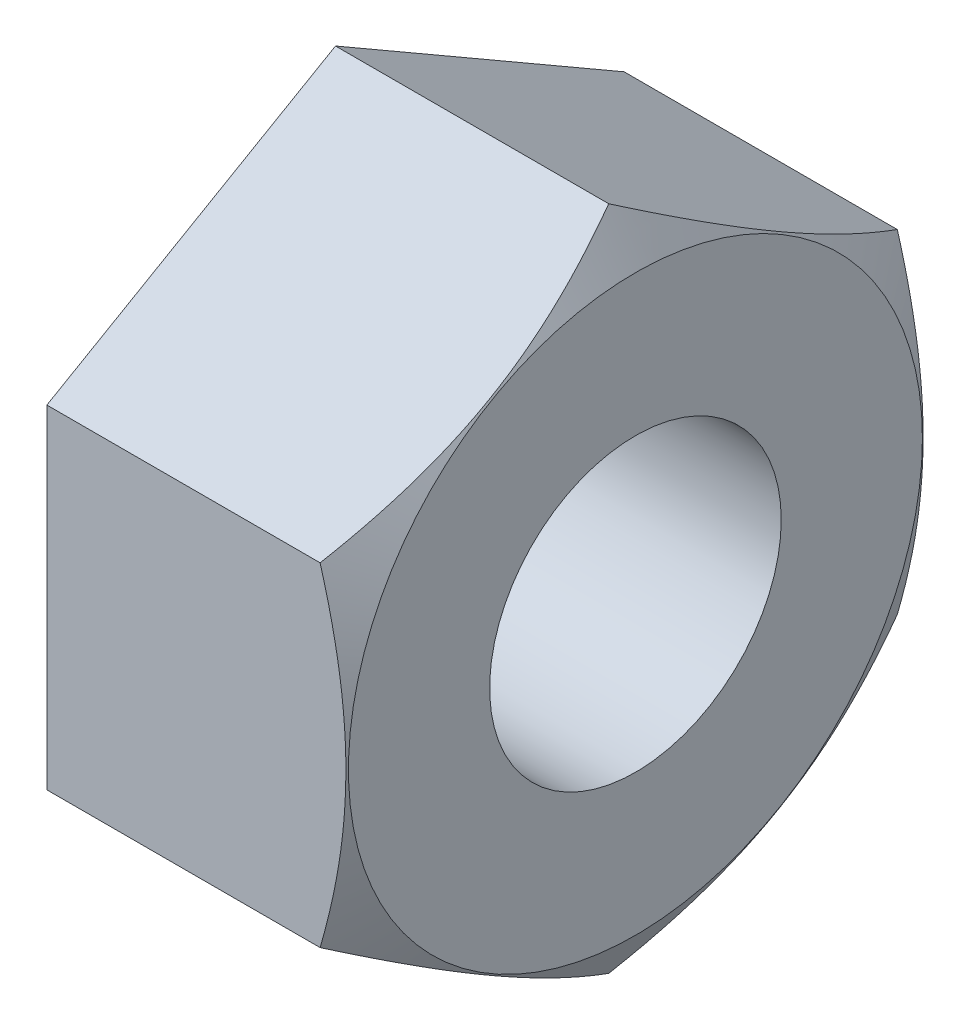
ISO-10303-21;
HEADER;
FILE_DESCRIPTION(('STEP AP214'),'2;1');
FILE_NAME('part.step','',(''),(''),'','','');
FILE_SCHEMA(('AUTOMOTIVE_DESIGN { 1 0 10303 214 1 1 1 1 }'));
ENDSEC;
DATA;
#1=APPLICATION_CONTEXT('core data for automotive mechanical design processes');
#2=APPLICATION_PROTOCOL_DEFINITION('international standard','automotive_design',2000,#1);
#3=PRODUCT_CONTEXT('',#1,'mechanical');
#4=PRODUCT('Part','Part','',(#3));
#5=PRODUCT_RELATED_PRODUCT_CATEGORY('part','',(#4));
#6=PRODUCT_DEFINITION_FORMATION('','',#4);
#7=PRODUCT_DEFINITION_CONTEXT('part definition',#1,'design');
#8=PRODUCT_DEFINITION('design','',#6,#7);
#9=PRODUCT_DEFINITION_SHAPE('','',#8);
#10=(LENGTH_UNIT() NAMED_UNIT(*) SI_UNIT(.MILLI.,.METRE.));
#11=(NAMED_UNIT(*) PLANE_ANGLE_UNIT() SI_UNIT($,.RADIAN.));
#12=(NAMED_UNIT(*) SI_UNIT($,.STERADIAN.) SOLID_ANGLE_UNIT());
#13=UNCERTAINTY_MEASURE_WITH_UNIT(LENGTH_MEASURE(1.E-05),#10,'distance_accuracy_value','');
#14=(GEOMETRIC_REPRESENTATION_CONTEXT(3) GLOBAL_UNCERTAINTY_ASSIGNED_CONTEXT((#13)) GLOBAL_UNIT_ASSIGNED_CONTEXT((#10,
#11,#12)) REPRESENTATION_CONTEXT('',''));
#15=CARTESIAN_POINT('',(0.,0.,0.));
#16=DIRECTION('',(0.,0.,1.));
#17=DIRECTION('',(1.,0.,0.));
#18=AXIS2_PLACEMENT_3D('',#15,#16,#17);
#19=CARTESIAN_POINT('',(21.6,-12.,20.7846096908265));
#20=DIRECTION('',(0.,0.866025403784439,-0.499999999999999));
#21=DIRECTION('',(0.,0.5,0.866025403784439));
#22=AXIS2_PLACEMENT_3D('',#19,#20,#21);
#23=PLANE('',#22);
#24=CARTESIAN_POINT('',(19.6756790384405,-11.9998845299462,20.7848096908265));
#25=CARTESIAN_POINT('',(19.8279471893094,-12.2636394383128,20.3279727887898));
#26=CARTESIAN_POINT('',(19.9733056236315,-12.5284231322602,19.8693539778572));
#27=CARTESIAN_POINT('',(20.2482824078248,-13.0601137691589,18.94843878084));
#28=CARTESIAN_POINT('',(20.3778955808251,-13.3270213798629,18.4861412381739));
#29=CARTESIAN_POINT('',(20.6196395702926,-13.8634756923534,17.5569751130009));
#30=CARTESIAN_POINT('',(20.7317290220058,-14.1330270885871,17.090098399473));
#31=CARTESIAN_POINT('',(20.9360186377609,-14.6740028630393,16.1531008724579));
#32=CARTESIAN_POINT('',(21.0282199408636,-14.9454271330726,15.6829802463528));
#33=CARTESIAN_POINT('',(21.1888116751901,-15.4831938662327,14.7515409418993));
#34=CARTESIAN_POINT('',(21.2577336384812,-15.7494964060008,14.2902914128362));
#35=CARTESIAN_POINT('',(21.3733001500024,-16.2833217102036,13.3656788635911));
#36=CARTESIAN_POINT('',(21.4199442694194,-16.550844498026,12.9023158029003));
#37=CARTESIAN_POINT('',(21.4897773519566,-17.0863394659307,11.9748113112918));
#38=CARTESIAN_POINT('',(21.5129941866113,-17.3543107311895,11.5106714648951));
#39=CARTESIAN_POINT('',(21.535473426564,-17.8905005573784,10.5819634434344));
#40=CARTESIAN_POINT('',(21.534736572068,-18.1587191104109,10.1173952820495));
#41=CARTESIAN_POINT('',(21.5109814022763,-18.6601588540007,9.24887616921767));
#42=CARTESIAN_POINT('',(21.4908598204711,-18.8934157559948,8.84486336374768));
#43=CARTESIAN_POINT('',(21.4328823591331,-19.3593726906644,8.03780227876086));
#44=CARTESIAN_POINT('',(21.3950267335981,-19.5920727312676,7.6347539855128));
#45=CARTESIAN_POINT('',(21.3022372681747,-20.0568299673038,6.82977083951292));
#46=CARTESIAN_POINT('',(21.2472879847729,-20.2888863892025,6.42783732656167));
#47=CARTESIAN_POINT('',(21.1212837210178,-20.7518881017849,5.62589483637755));
#48=CARTESIAN_POINT('',(21.0502288089057,-20.9828333971723,5.22588585099759));
#49=CARTESIAN_POINT('',(20.8110821074021,-21.6839341778009,4.01154367772263));
#50=CARTESIAN_POINT('',(20.6191316188568,-22.1520977019199,3.20066066769799));
#51=CARTESIAN_POINT('',(20.2923448464455,-22.8491727977797,1.99329118497797));
#52=CARTESIAN_POINT('',(20.1770566768712,-23.0804697165365,1.59267317005703));
#53=CARTESIAN_POINT('',(19.93480881905,-23.541463698911,0.794208170600849));
#54=CARTESIAN_POINT('',(19.8078524204605,-23.7711611939319,0.396360438853301));
#55=CARTESIAN_POINT('',(19.6756790384405,-24.0001154700538,-0.000200000000011983));
#56=B_SPLINE_CURVE_WITH_KNOTS('',3,(#24,#25,#26,#27,#28,#29,#30,#31,#32,#33,#34,#35,#36,#37,#38,
#39,#40,#41,#42,#43,#44,#45,#46,#47,#48,#49,#50,#51,#52,#53,#54,#55),.UNSPECIFIED.,.F.,.F.,(4,2,
2,2,2,2,2,2,2,2,2,2,2,2,2,4),(0.,1.64718297300077,3.29490606443561,4.94646171874215,
6.59792275780601,8.20862232704061,9.8193528984425,11.4281649098404,13.0369272065082,
14.4374315945823,15.8379159244004,17.2396692350121,18.6414166063712,21.5066563429886,
22.9367804503372,24.3665025883493),.UNSPECIFIED.);
#57=CARTESIAN_POINT('',(19.6757457055883,-12.,20.7846096908265));
#58=VERTEX_POINT('',#57);
#59=CARTESIAN_POINT('',(19.6757457055883,-24.,0.));
#60=VERTEX_POINT('',#59);
#61=EDGE_CURVE('E91',#58,#60,#56,.T.);
#62=ORIENTED_EDGE('',*,*,#61,.F.);
#63=DIRECTION('',(-1.,0.,0.));
#64=VECTOR('',#63,1.);
#65=CARTESIAN_POINT('',(21.6,-12.,20.7846096908265));
#66=LINE('',#65,#64);
#67=CARTESIAN_POINT('',(0.,-12.,20.7846096908265));
#68=VERTEX_POINT('',#67);
#69=EDGE_CURVE('E61',#58,#68,#66,.T.);
#70=ORIENTED_EDGE('',*,*,#69,.T.);
#71=DIRECTION('',(0.,-0.5,-0.866025403784439));
#72=VECTOR('',#71,1.);
#73=CARTESIAN_POINT('',(0.,-12.,20.7846096908265));
#74=LINE('',#73,#72);
#75=CARTESIAN_POINT('',(0.,-24.,0.));
#76=VERTEX_POINT('',#75);
#77=EDGE_CURVE('E98',#68,#76,#74,.T.);
#78=ORIENTED_EDGE('',*,*,#77,.T.);
#79=DIRECTION('',(-1.,0.,0.));
#80=VECTOR('',#79,1.);
#81=CARTESIAN_POINT('',(21.6,-24.,0.));
#82=LINE('',#81,#80);
#83=EDGE_CURVE('E12',#60,#76,#82,.T.);
#84=ORIENTED_EDGE('',*,*,#83,.F.);
#85=EDGE_LOOP('',(#62,#70,#78,#84));
#86=FACE_BOUND('',#85,.T.);
#87=ADVANCED_FACE('F38',(#86),#23,.F.);
#88=CARTESIAN_POINT('',(21.6,-24.,0.));
#89=DIRECTION('',(0.,0.866025403784438,0.5));
#90=DIRECTION('',(0.,-0.5,0.866025403784438));
#91=AXIS2_PLACEMENT_3D('',#88,#89,#90);
#92=PLANE('',#91);
#93=CARTESIAN_POINT('',(19.6756790384405,-24.0001154700538,0.00019999999998761));
#94=CARTESIAN_POINT('',(19.8279471893094,-23.7363605616872,-0.456636902036758));
#95=CARTESIAN_POINT('',(19.9733056236315,-23.4715768677398,-0.915255712969362));
#96=CARTESIAN_POINT('',(20.2482824078248,-22.9398862308411,-1.83617090998654));
#97=CARTESIAN_POINT('',(20.3778955808251,-22.6729786201371,-2.29846845265266));
#98=CARTESIAN_POINT('',(20.6196395702926,-22.1365243076466,-3.22763457782563));
#99=CARTESIAN_POINT('',(20.7317290220058,-21.8669729114129,-3.69451129135355));
#100=CARTESIAN_POINT('',(20.9360186377609,-21.3259971369607,-4.63150881836864));
#101=CARTESIAN_POINT('',(21.0282199408636,-21.0545728669274,-5.10162944447373));
#102=CARTESIAN_POINT('',(21.1888116751901,-20.5168061337673,-6.03306874892726));
#103=CARTESIAN_POINT('',(21.2577336384812,-20.2505035939992,-6.49431827799031));
#104=CARTESIAN_POINT('',(21.3733001500024,-19.7166782897964,-7.4189308272354));
#105=CARTESIAN_POINT('',(21.4199442694194,-19.449155501974,-7.88229388792628));
#106=CARTESIAN_POINT('',(21.4897773519566,-18.9136605340693,-8.80979837953471));
#107=CARTESIAN_POINT('',(21.5129941866113,-18.6456892688105,-9.27393822593141));
#108=CARTESIAN_POINT('',(21.535473426564,-18.1094994426216,-10.2026462473922));
#109=CARTESIAN_POINT('',(21.534736572068,-17.8412808895891,-10.667214408777));
#110=CARTESIAN_POINT('',(21.5109814022763,-17.3398411459993,-11.5357335216089));
#111=CARTESIAN_POINT('',(21.4908598204711,-17.1065842440052,-11.9397463270789));
#112=CARTESIAN_POINT('',(21.4328823591331,-16.6406273093356,-12.7468074120657));
#113=CARTESIAN_POINT('',(21.3950267335981,-16.4079272687324,-13.1498557053137));
#114=CARTESIAN_POINT('',(21.3022372681747,-15.9431700326962,-13.9548388513136));
#115=CARTESIAN_POINT('',(21.2472879847728,-15.7111136107975,-14.3567723642649));
#116=CARTESIAN_POINT('',(21.1212837210178,-15.2481118982151,-15.158714854449));
#117=CARTESIAN_POINT('',(21.0502288089057,-15.0171666028277,-15.5587238398289));
#118=CARTESIAN_POINT('',(20.8110821074021,-14.3160658221991,-16.7730660131039));
#119=CARTESIAN_POINT('',(20.6191316188568,-13.8479022980801,-17.5839490231285));
#120=CARTESIAN_POINT('',(20.2923448464455,-13.1508272022203,-18.7913185058486));
#121=CARTESIAN_POINT('',(20.1770566768712,-12.9195302834635,-19.1919365207695));
#122=CARTESIAN_POINT('',(19.93480881905,-12.458536301089,-19.9904015202257));
#123=CARTESIAN_POINT('',(19.8078524204605,-12.2288388060681,-20.3882492519732));
#124=CARTESIAN_POINT('',(19.6756790384405,-11.9998845299462,-20.7848096908265));
#125=B_SPLINE_CURVE_WITH_KNOTS('',3,(#93,#94,#95,#96,#97,#98,#99,#100,#101,#102,#103,#104,#105,
#106,#107,#108,#109,#110,#111,#112,#113,#114,#115,#116,#117,#118,#119,#120,#121,#122,#123,#124),
.UNSPECIFIED.,.F.,.F.,(4,2,2,2,2,2,2,2,2,2,2,2,2,2,2,4),(0.,1.64718297300076,3.29490606443561,
4.94646171874215,6.59792275780601,8.2086223270406,9.81935289844249,11.4281649098404,
13.0369272065082,14.4374315945823,15.8379159244004,17.2396692350121,18.6414166063712,
21.5066563429886,22.9367804503372,24.3665025883493),.UNSPECIFIED.);
#126=CARTESIAN_POINT('',(19.6757457055883,-12.,-20.7846096908265));
#127=VERTEX_POINT('',#126);
#128=EDGE_CURVE('E99',#60,#127,#125,.T.);
#129=ORIENTED_EDGE('',*,*,#128,.F.);
#130=ORIENTED_EDGE('',*,*,#83,.T.);
#131=DIRECTION('',(0.,0.5,-0.866025403784438));
#132=VECTOR('',#131,1.);
#133=CARTESIAN_POINT('',(0.,-24.,0.));
#134=LINE('',#133,#132);
#135=CARTESIAN_POINT('',(0.,-12.,-20.7846096908265));
#136=VERTEX_POINT('',#135);
#137=EDGE_CURVE('E128',#76,#136,#134,.T.);
#138=ORIENTED_EDGE('',*,*,#137,.T.);
#139=DIRECTION('',(-1.,0.,0.));
#140=VECTOR('',#139,1.);
#141=CARTESIAN_POINT('',(21.6,-12.,-20.7846096908265));
#142=LINE('',#141,#140);
#143=EDGE_CURVE('E46',#127,#136,#142,.T.);
#144=ORIENTED_EDGE('',*,*,#143,.F.);
#145=EDGE_LOOP('',(#129,#130,#138,#144));
#146=FACE_BOUND('',#145,.T.);
#147=ADVANCED_FACE('F129',(#146),#92,.F.);
#148=CARTESIAN_POINT('',(21.6,-12.,-20.7846096908265));
#149=DIRECTION('',(0.,0.,1.));
#150=DIRECTION('',(0.,-1.,0.));
#151=AXIS2_PLACEMENT_3D('',#148,#149,#150);
#152=PLANE('',#151);
#153=CARTESIAN_POINT('',(5.89964963702571,-43.1122440620344,-20.7846096908265));
#154=CARTESIAN_POINT('',(6.16017943941647,-42.6112850083838,-20.7846096908265));
#155=CARTESIAN_POINT('',(6.42003918269258,-42.1099775963924,-20.7846096908265));
#156=CARTESIAN_POINT('',(6.9382804194202,-41.1065976005653,-20.7846096908265));
#157=CARTESIAN_POINT('',(7.19666190880449,-40.6045250146291,-20.7846096908265));
#158=CARTESIAN_POINT('',(7.96940115928326,-39.0970189926914,-20.7846096908265));
#159=CARTESIAN_POINT('',(8.48133192637945,-38.0903391093104,-20.7846096908265));
#160=CARTESIAN_POINT('',(9.49811035830234,-36.0714505636969,-20.7846096908265));
#161=CARTESIAN_POINT('',(10.0029458324949,-35.0592357554343,-20.7846096908265));
#162=CARTESIAN_POINT('',(11.0028910071021,-33.0300239213332,-20.7846096908265));
#163=CARTESIAN_POINT('',(11.4980008543328,-32.0130269679728,-20.7846096908265));
#164=CARTESIAN_POINT('',(12.503369901476,-29.9163665074545,-20.7846096908265));
#165=CARTESIAN_POINT('',(13.0129352958957,-28.8363696595944,-20.7846096908265));
#166=CARTESIAN_POINT('',(14.0148415439382,-26.6683202415926,-20.7846096908265));
#167=CARTESIAN_POINT('',(14.507181693338,-25.5802673442923,-20.7846096908265));
#168=CARTESIAN_POINT('',(15.2286956846048,-23.9410498303502,-20.7846096908265));
#169=CARTESIAN_POINT('',(15.4663083334253,-23.3935969309336,-20.7846096908265));
#170=CARTESIAN_POINT('',(15.9350686031358,-22.2959332843393,-20.7846096908265));
#171=CARTESIAN_POINT('',(16.1662163066004,-21.7457225724922,-20.7846096908265));
#172=CARTESIAN_POINT('',(16.6210689597723,-20.6422722870928,-20.7846096908265));
#173=CARTESIAN_POINT('',(16.8447744204259,-20.0890329245219,-20.7846096908265));
#174=CARTESIAN_POINT('',(17.2836097535685,-18.9791703873642,-20.7846096908265));
#175=CARTESIAN_POINT('',(17.4987397960502,-18.4225472801066,-20.7846096908265));
#176=CARTESIAN_POINT('',(17.945211522051,-17.2361538322958,-20.7846096908265));
#177=CARTESIAN_POINT('',(18.1752455349034,-16.6058894882217,-20.7846096908265));
#178=CARTESIAN_POINT('',(18.6205426831597,-15.3401463107598,-20.7846096908265));
#179=CARTESIAN_POINT('',(18.8358058496154,-14.7046674883373,-20.7846096908265));
#180=CARTESIAN_POINT('',(19.2489508495254,-13.4279211425155,-20.7846096908265));
#181=CARTESIAN_POINT('',(19.4468292957319,-12.7866525177507,-20.7846096908265));
#182=CARTESIAN_POINT('',(19.822093096265,-11.49811166928,-20.7846096908265));
#183=CARTESIAN_POINT('',(19.9994784766718,-10.8508394532156,-20.7846096908265));
#184=CARTESIAN_POINT('',(20.3269722452134,-9.56333677187745,-20.7846096908265));
#185=CARTESIAN_POINT('',(20.4775602204052,-8.92322910178017,-20.7846096908265));
#186=CARTESIAN_POINT('',(20.7523112603828,-7.63737965217776,-20.7846096908265));
#187=CARTESIAN_POINT('',(20.8764766479449,-6.99163837311568,-20.7846096908265));
#188=CARTESIAN_POINT('',(21.0949315569991,-5.69537500364518,-20.7846096908265));
#189=CARTESIAN_POINT('',(21.1892346074587,-5.04485521518483,-20.7846096908265));
#190=CARTESIAN_POINT('',(21.345011192547,-3.73986531513738,-20.7846096908265));
#191=CARTESIAN_POINT('',(21.4064852153136,-3.08539526243348,-20.7846096908265));
#192=CARTESIAN_POINT('',(21.4951021063419,-1.76339705084909,-20.7846096908265));
#193=CARTESIAN_POINT('',(21.5216696455769,-1.09582979405868,-20.7846096908265));
#194=CARTESIAN_POINT('',(21.5375458363044,0.239750272904903,-20.7846096908265));
#195=CARTESIAN_POINT('',(21.526854589797,0.907763081853331,-20.7846096908265));
#196=CARTESIAN_POINT('',(21.4686397310552,2.2422918885784,-20.7846096908265));
#197=CARTESIAN_POINT('',(21.421108995262,2.9088075718581,-20.7846096908265));
#198=CARTESIAN_POINT('',(21.2910397144409,4.23839120876551,-20.7846096908265));
#199=CARTESIAN_POINT('',(21.2085002306748,4.90145906945932,-20.7846096908265));
#200=CARTESIAN_POINT('',(21.009208973443,6.2367660678869,-20.7846096908265));
#201=CARTESIAN_POINT('',(20.8917687186521,6.9089014563664,-20.7846096908265));
#202=CARTESIAN_POINT('',(20.6270959389255,8.24723474413655,-20.7846096908265));
#203=CARTESIAN_POINT('',(20.479862920995,8.91343254498469,-20.7846096908265));
#204=CARTESIAN_POINT('',(20.1594285228237,10.2397373908018,-20.7846096908265));
#205=CARTESIAN_POINT('',(19.9862185705204,10.8998423485929,-20.7846096908265));
#206=CARTESIAN_POINT('',(19.6175722751179,12.2137770748745,-20.7846096908265));
#207=CARTESIAN_POINT('',(19.4221358737342,12.8676068269045,-20.7846096908265));
#208=CARTESIAN_POINT('',(19.0075382855866,14.1846815063567,-20.7846096908265));
#209=CARTESIAN_POINT('',(18.7879254055005,14.84778352852,-20.7846096908265));
#210=CARTESIAN_POINT('',(18.3320171815299,16.1682510502702,-20.7846096908265));
#211=CARTESIAN_POINT('',(18.0957207146123,16.8256161603317,-20.7846096908265));
#212=CARTESIAN_POINT('',(17.6090312596657,18.1352844615015,-20.7846096908265));
#213=CARTESIAN_POINT('',(17.3586345998532,18.7875862833076,-20.7846096908265));
#214=CARTESIAN_POINT('',(16.8460089860985,20.0874945924026,-20.7846096908265));
#215=CARTESIAN_POINT('',(16.5837802794919,20.735101177512,-20.7846096908265));
#216=CARTESIAN_POINT('',(16.048949746251,22.0270307615499,-20.7846096908265));
#217=CARTESIAN_POINT('',(15.7763344014175,22.6713481513309,-20.7846096908265));
#218=CARTESIAN_POINT('',(15.2225758827157,23.9563039828261,-20.7846096908265));
#219=CARTESIAN_POINT('',(14.9414326731017,24.5969424091058,-20.7846096908265));
#220=CARTESIAN_POINT('',(14.3719123527427,25.8748792905204,-20.7846096908265));
#221=CARTESIAN_POINT('',(14.083536300304,26.5121782179818,-20.7846096908265));
#222=CARTESIAN_POINT('',(13.5005410846812,27.7839078235592,-20.7846096908265));
#223=CARTESIAN_POINT('',(13.2059219350748,28.4183385079095,-20.7846096908265));
#224=CARTESIAN_POINT('',(12.3510411836272,30.2389999707912,-20.7846096908265));
#225=CARTESIAN_POINT('',(11.7840261942207,31.4220607237577,-20.7846096908265));
#226=CARTESIAN_POINT('',(10.6355273007669,33.7811702693633,-20.7846096908265));
#227=CARTESIAN_POINT('',(10.0540428026718,34.9572187716481,-20.7846096908265));
#228=CARTESIAN_POINT('',(8.88206433094894,37.2990619404268,-20.7846096908265));
#229=CARTESIAN_POINT('',(8.29161449525383,38.4648787215131,-20.7846096908265));
#230=CARTESIAN_POINT('',(7.39927868080276,40.2101221534605,-20.7846096908265));
#231=CARTESIAN_POINT('',(7.10073700834932,40.7912632333385,-20.7846096908265));
#232=CARTESIAN_POINT('',(6.50164520394217,41.9525060202557,-20.7846096908265));
#233=CARTESIAN_POINT('',(6.20109508116068,42.5326077320263,-20.7846096908265));
#234=CARTESIAN_POINT('',(5.89964963702571,43.1122440620344,-20.7846096908265));
#235=B_SPLINE_CURVE_WITH_KNOTS('',3,(#153,#154,#155,#156,#157,#158,#159,#160,#161,#162,#163,
#164,#165,#166,#167,#168,#169,#170,#171,#172,#173,#174,#175,#176,#177,#178,#179,#180,#181,#182,
#183,#184,#185,#186,#187,#188,#189,#190,#191,#192,#193,#194,#195,#196,#197,#198,#199,#200,#201,
#202,#203,#204,#205,#206,#207,#208,#209,#210,#211,#212,#213,#214,#215,#216,#217,#218,#219,#220,
#221,#222,#223,#224,#225,#226,#227,#228,#229,#230,#231,#232,#233,#234),.UNSPECIFIED.,.F.,.F.,(4,
2,2,2,2,2,2,2,2,2,2,2,2,2,2,2,2,2,2,2,2,2,2,2,2,2,2,2,2,2,2,2,2,2,2,2,2,2,2,2,4),(0.,
1.69396532126792,3.38793530102754,6.77601669945892,10.1693425547659,13.5626171456711,
17.1450286304869,20.7275864049935,22.5179386525702,24.3082680221276,26.0984742220847,
27.8886449166472,29.9012816117235,31.913914075611,33.9269378161648,35.9399589948457,
37.9122197951265,39.8843071447607,41.8554997685784,43.8266630817243,45.8299237073251,
47.8331788487804,49.836821451276,51.8405177836173,53.886710571652,55.9329372217658,
57.9798405927978,60.0267493315637,62.1220553240715,64.2175024939827,66.3134978785032,
68.4094494688726,70.5082289456023,72.6070172208879,74.7055001735681,76.8039785628464,
80.7395986969524,84.6753806760123,88.5957676250477,90.5557822179995,92.5157878660374),.UNSPECIFIED.);
#236=CARTESIAN_POINT('',(19.6757457055883,12.,-20.7846096908265));
#237=VERTEX_POINT('',#236);
#238=EDGE_CURVE('E125',#127,#237,#235,.T.);
#239=ORIENTED_EDGE('',*,*,#238,.F.);
#240=ORIENTED_EDGE('',*,*,#143,.T.);
#241=DIRECTION('',(0.,1.,0.));
#242=VECTOR('',#241,1.);
#243=CARTESIAN_POINT('',(0.,-12.,-20.7846096908265));
#244=LINE('',#243,#242);
#245=CARTESIAN_POINT('',(0.,12.,-20.7846096908265));
#246=VERTEX_POINT('',#245);
#247=EDGE_CURVE('E123',#136,#246,#244,.T.);
#248=ORIENTED_EDGE('',*,*,#247,.T.);
#249=DIRECTION('',(-1.,0.,0.));
#250=VECTOR('',#249,1.);
#251=CARTESIAN_POINT('',(21.6,12.,-20.7846096908265));
#252=LINE('',#251,#250);
#253=EDGE_CURVE('E114',#237,#246,#252,.T.);
#254=ORIENTED_EDGE('',*,*,#253,.F.);
#255=EDGE_LOOP('',(#239,#240,#248,#254));
#256=FACE_BOUND('',#255,.T.);
#257=ADVANCED_FACE('F120',(#256),#152,.F.);
#258=CARTESIAN_POINT('',(21.6,12.,-20.7846096908265));
#259=DIRECTION('',(0.,-0.866025403784439,0.5));
#260=DIRECTION('',(0.,-0.5,-0.866025403784439));
#261=AXIS2_PLACEMENT_3D('',#258,#259,#260);
#262=PLANE('',#261);
#263=CARTESIAN_POINT('',(19.6756790384405,11.9998845299462,-20.7848096908265));
#264=CARTESIAN_POINT('',(19.8279471893094,12.2636394383128,-20.3279727887898));
#265=CARTESIAN_POINT('',(19.9733056236315,12.5284231322602,-19.8693539778572));
#266=CARTESIAN_POINT('',(20.2482824078248,13.0601137691589,-18.94843878084));
#267=CARTESIAN_POINT('',(20.3778955808251,13.3270213798629,-18.4861412381739));
#268=CARTESIAN_POINT('',(20.6196395702926,13.8634756923534,-17.5569751130009));
#269=CARTESIAN_POINT('',(20.7317290220058,14.1330270885871,-17.090098399473));
#270=CARTESIAN_POINT('',(20.9360186377609,14.6740028630393,-16.1531008724579));
#271=CARTESIAN_POINT('',(21.0282199408636,14.9454271330726,-15.6829802463528));
#272=CARTESIAN_POINT('',(21.1888116751901,15.4831938662327,-14.7515409418993));
#273=CARTESIAN_POINT('',(21.2577336384812,15.7494964060008,-14.2902914128362));
#274=CARTESIAN_POINT('',(21.3733001500024,16.2833217102036,-13.3656788635911));
#275=CARTESIAN_POINT('',(21.4199442694194,16.550844498026,-12.9023158029003));
#276=CARTESIAN_POINT('',(21.4897773519566,17.0863394659307,-11.9748113112918));
#277=CARTESIAN_POINT('',(21.5129941866113,17.3543107311895,-11.5106714648951));
#278=CARTESIAN_POINT('',(21.535473426564,17.8905005573784,-10.5819634434344));
#279=CARTESIAN_POINT('',(21.534736572068,18.1587191104109,-10.1173952820495));
#280=CARTESIAN_POINT('',(21.5109814022763,18.6601588540007,-9.24887616921767));
#281=CARTESIAN_POINT('',(21.4908598204711,18.8934157559948,-8.84486336374768));
#282=CARTESIAN_POINT('',(21.4328823591331,19.3593726906644,-8.03780227876086));
#283=CARTESIAN_POINT('',(21.3950267335981,19.5920727312676,-7.6347539855128));
#284=CARTESIAN_POINT('',(21.3022372681747,20.0568299673038,-6.82977083951292));
#285=CARTESIAN_POINT('',(21.2472879847728,20.2888863892025,-6.42783732656167));
#286=CARTESIAN_POINT('',(21.1212837210178,20.7518881017849,-5.62589483637755));
#287=CARTESIAN_POINT('',(21.0502288089057,20.9828333971723,-5.22588585099759));
#288=CARTESIAN_POINT('',(20.8110821074021,21.6839341778009,-4.01154367772263));
#289=CARTESIAN_POINT('',(20.6191316188568,22.1520977019199,-3.20066066769799));
#290=CARTESIAN_POINT('',(20.2923448464455,22.8491727977797,-1.99329118497796));
#291=CARTESIAN_POINT('',(20.1770566768712,23.0804697165365,-1.59267317005703));
#292=CARTESIAN_POINT('',(19.93480881905,23.541463698911,-0.794208170600847));
#293=CARTESIAN_POINT('',(19.8078524204605,23.7711611939319,-0.3963604388533));
#294=CARTESIAN_POINT('',(19.6756790384405,24.0001154700538,0.000200000000013233));
#295=B_SPLINE_CURVE_WITH_KNOTS('',3,(#263,#264,#265,#266,#267,#268,#269,#270,#271,#272,#273,
#274,#275,#276,#277,#278,#279,#280,#281,#282,#283,#284,#285,#286,#287,#288,#289,#290,#291,#292,
#293,#294),.UNSPECIFIED.,.F.,.F.,(4,2,2,2,2,2,2,2,2,2,2,2,2,2,2,4),(0.,1.64718297300076,
3.29490606443561,4.94646171874214,6.59792275780601,8.2086223270406,9.81935289844249,
11.4281649098404,13.0369272065082,14.4374315945823,15.8379159244004,17.2396692350121,
18.6414166063712,21.5066563429886,22.9367804503372,24.3665025883493),.UNSPECIFIED.);
#296=CARTESIAN_POINT('',(19.6757457055883,24.,0.));
#297=VERTEX_POINT('',#296);
#298=EDGE_CURVE('E180',#237,#297,#295,.T.);
#299=ORIENTED_EDGE('',*,*,#298,.F.);
#300=ORIENTED_EDGE('',*,*,#253,.T.);
#301=DIRECTION('',(0.,0.5,0.866025403784439));
#302=VECTOR('',#301,1.);
#303=CARTESIAN_POINT('',(0.,12.,-20.7846096908265));
#304=LINE('',#303,#302);
#305=CARTESIAN_POINT('',(0.,24.,0.));
#306=VERTEX_POINT('',#305);
#307=EDGE_CURVE('E135',#246,#306,#304,.T.);
#308=ORIENTED_EDGE('',*,*,#307,.T.);
#309=DIRECTION('',(-1.,0.,0.));
#310=VECTOR('',#309,1.);
#311=CARTESIAN_POINT('',(21.6,24.,0.));
#312=LINE('',#311,#310);
#313=EDGE_CURVE('E107',#297,#306,#312,.T.);
#314=ORIENTED_EDGE('',*,*,#313,.F.);
#315=EDGE_LOOP('',(#299,#300,#308,#314));
#316=FACE_BOUND('',#315,.T.);
#317=ADVANCED_FACE('F193',(#316),#262,.F.);
#318=CARTESIAN_POINT('',(21.6,24.,0.));
#319=DIRECTION('',(0.,-0.866025403784438,-0.5));
#320=DIRECTION('',(0.,0.5,-0.866025403784438));
#321=AXIS2_PLACEMENT_3D('',#318,#319,#320);
#322=PLANE('',#321);
#323=CARTESIAN_POINT('',(19.6756790384405,24.0001154700538,-0.000199999999987957));
#324=CARTESIAN_POINT('',(19.8279471893094,23.7363605616872,0.456636902036757));
#325=CARTESIAN_POINT('',(19.9733056236315,23.4715768677398,0.915255712969361));
#326=CARTESIAN_POINT('',(20.2482824078248,22.9398862308411,1.83617090998654));
#327=CARTESIAN_POINT('',(20.3778955808251,22.6729786201371,2.29846845265266));
#328=CARTESIAN_POINT('',(20.6196395702926,22.1365243076466,3.22763457782563));
#329=CARTESIAN_POINT('',(20.7317290220058,21.8669729114129,3.69451129135354));
#330=CARTESIAN_POINT('',(20.9360186377609,21.3259971369608,4.63150881836864));
#331=CARTESIAN_POINT('',(21.0282199408636,21.0545728669274,5.10162944447373));
#332=CARTESIAN_POINT('',(21.1888116751901,20.5168061337673,6.03306874892726));
#333=CARTESIAN_POINT('',(21.2577336384812,20.2505035939992,6.49431827799031));
#334=CARTESIAN_POINT('',(21.3733001500024,19.7166782897964,7.4189308272354));
#335=CARTESIAN_POINT('',(21.4199442694194,19.449155501974,7.88229388792628));
#336=CARTESIAN_POINT('',(21.4897773519566,18.9136605340693,8.80979837953471));
#337=CARTESIAN_POINT('',(21.5129941866113,18.6456892688105,9.27393822593141));
#338=CARTESIAN_POINT('',(21.535473426564,18.1094994426216,10.2026462473922));
#339=CARTESIAN_POINT('',(21.534736572068,17.8412808895891,10.667214408777));
#340=CARTESIAN_POINT('',(21.5109814022763,17.3398411459993,11.5357335216089));
#341=CARTESIAN_POINT('',(21.4908598204711,17.1065842440052,11.9397463270789));
#342=CARTESIAN_POINT('',(21.4328823591331,16.6406273093356,12.7468074120657));
#343=CARTESIAN_POINT('',(21.3950267335981,16.4079272687324,13.1498557053137));
#344=CARTESIAN_POINT('',(21.3022372681747,15.9431700326962,13.9548388513136));
#345=CARTESIAN_POINT('',(21.2472879847728,15.7111136107975,14.3567723642649));
#346=CARTESIAN_POINT('',(21.1212837210178,15.2481118982151,15.158714854449));
#347=CARTESIAN_POINT('',(21.0502288089057,15.0171666028277,15.5587238398289));
#348=CARTESIAN_POINT('',(20.8110821074021,14.3160658221991,16.7730660131039));
#349=CARTESIAN_POINT('',(20.6191316188568,13.8479022980801,17.5839490231285));
#350=CARTESIAN_POINT('',(20.2923448464455,13.1508272022203,18.7913185058486));
#351=CARTESIAN_POINT('',(20.1770566768712,12.9195302834635,19.1919365207695));
#352=CARTESIAN_POINT('',(19.93480881905,12.458536301089,19.9904015202257));
#353=CARTESIAN_POINT('',(19.8078524204605,12.2288388060681,20.3882492519732));
#354=CARTESIAN_POINT('',(19.6756790384405,11.9998845299462,20.7848096908265));
#355=B_SPLINE_CURVE_WITH_KNOTS('',3,(#323,#324,#325,#326,#327,#328,#329,#330,#331,#332,#333,
#334,#335,#336,#337,#338,#339,#340,#341,#342,#343,#344,#345,#346,#347,#348,#349,#350,#351,#352,
#353,#354),.UNSPECIFIED.,.F.,.F.,(4,2,2,2,2,2,2,2,2,2,2,2,2,2,2,4),(0.,1.64718297300076,
3.29490606443561,4.94646171874215,6.59792275780601,8.20862232704061,9.81935289844249,
11.4281649098404,13.0369272065082,14.4374315945823,15.8379159244004,17.2396692350121,
18.6414166063712,21.5066563429886,22.9367804503372,24.3665025883493),.UNSPECIFIED.);
#356=CARTESIAN_POINT('',(19.6757457055883,12.,20.7846096908265));
#357=VERTEX_POINT('',#356);
#358=EDGE_CURVE('E53',#297,#357,#355,.T.);
#359=ORIENTED_EDGE('',*,*,#358,.F.);
#360=ORIENTED_EDGE('',*,*,#313,.T.);
#361=DIRECTION('',(0.,-0.5,0.866025403784438));
#362=VECTOR('',#361,1.);
#363=CARTESIAN_POINT('',(0.,24.,0.));
#364=LINE('',#363,#362);
#365=CARTESIAN_POINT('',(0.,12.,20.7846096908265));
#366=VERTEX_POINT('',#365);
#367=EDGE_CURVE('E109',#306,#366,#364,.T.);
#368=ORIENTED_EDGE('',*,*,#367,.T.);
#369=DIRECTION('',(-1.,0.,0.));
#370=VECTOR('',#369,1.);
#371=CARTESIAN_POINT('',(21.6,12.,20.7846096908265));
#372=LINE('',#371,#370);
#373=EDGE_CURVE('E105',#357,#366,#372,.T.);
#374=ORIENTED_EDGE('',*,*,#373,.F.);
#375=EDGE_LOOP('',(#359,#360,#368,#374));
#376=FACE_BOUND('',#375,.T.);
#377=ADVANCED_FACE('F141',(#376),#322,.F.);
#378=CARTESIAN_POINT('',(21.6,12.,20.7846096908265));
#379=DIRECTION('',(0.,0.,-1.));
#380=DIRECTION('',(-1.,0.,0.));
#381=AXIS2_PLACEMENT_3D('',#378,#379,#380);
#382=PLANE('',#381);
#383=CARTESIAN_POINT('',(5.89964963702571,43.1122440620344,20.7846096908265));
#384=CARTESIAN_POINT('',(6.16017943941647,42.6112850083838,20.7846096908265));
#385=CARTESIAN_POINT('',(6.42003918269258,42.1099775963924,20.7846096908265));
#386=CARTESIAN_POINT('',(6.9382804194202,41.1065976005653,20.7846096908265));
#387=CARTESIAN_POINT('',(7.19666190880448,40.6045250146291,20.7846096908265));
#388=CARTESIAN_POINT('',(7.96940115928326,39.0970189926914,20.7846096908265));
#389=CARTESIAN_POINT('',(8.48133192637944,38.0903391093105,20.7846096908265));
#390=CARTESIAN_POINT('',(9.49811035830233,36.0714505636969,20.7846096908265));
#391=CARTESIAN_POINT('',(10.0029458324949,35.0592357554343,20.7846096908265));
#392=CARTESIAN_POINT('',(11.0028910071021,33.0300239213333,20.7846096908265));
#393=CARTESIAN_POINT('',(11.4980008543328,32.0130269679728,20.7846096908265));
#394=CARTESIAN_POINT('',(12.503369901476,29.9163665074546,20.7846096908265));
#395=CARTESIAN_POINT('',(13.0129352958957,28.8363696595944,20.7846096908265));
#396=CARTESIAN_POINT('',(14.0148415439382,26.6683202415926,20.7846096908265));
#397=CARTESIAN_POINT('',(14.507181693338,25.5802673442923,20.7846096908265));
#398=CARTESIAN_POINT('',(15.2286956846048,23.9410498303502,20.7846096908265));
#399=CARTESIAN_POINT('',(15.4663083334253,23.3935969309336,20.7846096908265));
#400=CARTESIAN_POINT('',(15.9350686031358,22.2959332843393,20.7846096908265));
#401=CARTESIAN_POINT('',(16.1662163066003,21.7457225724922,20.7846096908265));
#402=CARTESIAN_POINT('',(16.6210689597722,20.6422722870929,20.7846096908265));
#403=CARTESIAN_POINT('',(16.8447744204259,20.0890329245219,20.7846096908265));
#404=CARTESIAN_POINT('',(17.2836097535685,18.9791703873642,20.7846096908265));
#405=CARTESIAN_POINT('',(17.4987397960502,18.4225472801066,20.7846096908265));
#406=CARTESIAN_POINT('',(17.945211522051,17.2361538322958,20.7846096908265));
#407=CARTESIAN_POINT('',(18.1752455349034,16.6058894882217,20.7846096908265));
#408=CARTESIAN_POINT('',(18.6205426831597,15.3401463107598,20.7846096908265));
#409=CARTESIAN_POINT('',(18.8358058496154,14.7046674883373,20.7846096908265));
#410=CARTESIAN_POINT('',(19.2489508495254,13.4279211425155,20.7846096908265));
#411=CARTESIAN_POINT('',(19.4468292957319,12.7866525177507,20.7846096908265));
#412=CARTESIAN_POINT('',(19.822093096265,11.49811166928,20.7846096908265));
#413=CARTESIAN_POINT('',(19.9994784766718,10.8508394532156,20.7846096908265));
#414=CARTESIAN_POINT('',(20.3269722452134,9.56333677187745,20.7846096908265));
#415=CARTESIAN_POINT('',(20.4775602204052,8.92322910178018,20.7846096908265));
#416=CARTESIAN_POINT('',(20.7523112603828,7.63737965217777,20.7846096908265));
#417=CARTESIAN_POINT('',(20.8764766479449,6.99163837311569,20.7846096908265));
#418=CARTESIAN_POINT('',(21.0949315569991,5.69537500364518,20.7846096908265));
#419=CARTESIAN_POINT('',(21.1892346074587,5.04485521518484,20.7846096908265));
#420=CARTESIAN_POINT('',(21.345011192547,3.73986531513739,20.7846096908265));
#421=CARTESIAN_POINT('',(21.4064852153136,3.08539526243348,20.7846096908265));
#422=CARTESIAN_POINT('',(21.4951021063419,1.7633970508491,20.7846096908265));
#423=CARTESIAN_POINT('',(21.5216696455769,1.09582979405869,20.7846096908265));
#424=CARTESIAN_POINT('',(21.5375458363044,-0.239750272904896,20.7846096908265));
#425=CARTESIAN_POINT('',(21.526854589797,-0.907763081853323,20.7846096908265));
#426=CARTESIAN_POINT('',(21.4686397310552,-2.24229188857839,20.7846096908265));
#427=CARTESIAN_POINT('',(21.421108995262,-2.90880757185809,20.7846096908265));
#428=CARTESIAN_POINT('',(21.2910397144408,-4.23839120876551,20.7846096908265));
#429=CARTESIAN_POINT('',(21.2085002306748,-4.90145906945932,20.7846096908265));
#430=CARTESIAN_POINT('',(21.009208973443,-6.23676606788691,20.7846096908265));
#431=CARTESIAN_POINT('',(20.8917687186521,-6.9089014563664,20.7846096908265));
#432=CARTESIAN_POINT('',(20.6270959389255,-8.24723474413655,20.7846096908265));
#433=CARTESIAN_POINT('',(20.479862920995,-8.91343254498469,20.7846096908265));
#434=CARTESIAN_POINT('',(20.1594285228237,-10.2397373908018,20.7846096908265));
#435=CARTESIAN_POINT('',(19.9862185705204,-10.8998423485929,20.7846096908265));
#436=CARTESIAN_POINT('',(19.6175722751179,-12.2137770748745,20.7846096908265));
#437=CARTESIAN_POINT('',(19.4221358737342,-12.8676068269045,20.7846096908265));
#438=CARTESIAN_POINT('',(19.0075382855866,-14.1846815063567,20.7846096908265));
#439=CARTESIAN_POINT('',(18.7879254055005,-14.84778352852,20.7846096908265));
#440=CARTESIAN_POINT('',(18.3320171815299,-16.1682510502702,20.7846096908265));
#441=CARTESIAN_POINT('',(18.0957207146123,-16.8256161603317,20.7846096908265));
#442=CARTESIAN_POINT('',(17.6090312596657,-18.1352844615015,20.7846096908265));
#443=CARTESIAN_POINT('',(17.3586345998532,-18.7875862833076,20.7846096908265));
#444=CARTESIAN_POINT('',(16.8460089860985,-20.0874945924026,20.7846096908265));
#445=CARTESIAN_POINT('',(16.5837802794919,-20.735101177512,20.7846096908265));
#446=CARTESIAN_POINT('',(16.048949746251,-22.0270307615499,20.7846096908265));
#447=CARTESIAN_POINT('',(15.7763344014175,-22.671348151331,20.7846096908265));
#448=CARTESIAN_POINT('',(15.2225758827157,-23.9563039828261,20.7846096908265));
#449=CARTESIAN_POINT('',(14.9414326731017,-24.5969424091058,20.7846096908265));
#450=CARTESIAN_POINT('',(14.3719123527426,-25.8748792905204,20.7846096908265));
#451=CARTESIAN_POINT('',(14.083536300304,-26.5121782179818,20.7846096908265));
#452=CARTESIAN_POINT('',(13.5005410846812,-27.7839078235592,20.7846096908265));
#453=CARTESIAN_POINT('',(13.2059219350748,-28.4183385079095,20.7846096908265));
#454=CARTESIAN_POINT('',(12.3510411836272,-30.2389999707913,20.7846096908265));
#455=CARTESIAN_POINT('',(11.7840261942207,-31.4220607237577,20.7846096908265));
#456=CARTESIAN_POINT('',(10.6355273007669,-33.7811702693633,20.7846096908265));
#457=CARTESIAN_POINT('',(10.0540428026718,-34.9572187716481,20.7846096908265));
#458=CARTESIAN_POINT('',(8.88206433094893,-37.2990619404268,20.7846096908265));
#459=CARTESIAN_POINT('',(8.29161449525382,-38.4648787215131,20.7846096908265));
#460=CARTESIAN_POINT('',(7.39927868080275,-40.2101221534605,20.7846096908265));
#461=CARTESIAN_POINT('',(7.10073700834931,-40.7912632333385,20.7846096908265));
#462=CARTESIAN_POINT('',(6.50164520394216,-41.9525060202557,20.7846096908265));
#463=CARTESIAN_POINT('',(6.20109508116068,-42.5326077320263,20.7846096908265));
#464=CARTESIAN_POINT('',(5.89964963702571,-43.1122440620344,20.7846096908265));
#465=B_SPLINE_CURVE_WITH_KNOTS('',3,(#383,#384,#385,#386,#387,#388,#389,#390,#391,#392,#393,
#394,#395,#396,#397,#398,#399,#400,#401,#402,#403,#404,#405,#406,#407,#408,#409,#410,#411,#412,
#413,#414,#415,#416,#417,#418,#419,#420,#421,#422,#423,#424,#425,#426,#427,#428,#429,#430,#431,
#432,#433,#434,#435,#436,#437,#438,#439,#440,#441,#442,#443,#444,#445,#446,#447,#448,#449,#450,
#451,#452,#453,#454,#455,#456,#457,#458,#459,#460,#461,#462,#463,#464),.UNSPECIFIED.,.F.,.F.,(4,
2,2,2,2,2,2,2,2,2,2,2,2,2,2,2,2,2,2,2,2,2,2,2,2,2,2,2,2,2,2,2,2,2,2,2,2,2,2,2,4),(0.,
1.69396532126792,3.38793530102753,6.7760166994589,10.1693425547659,13.5626171456711,
17.1450286304869,20.7275864049935,22.5179386525702,24.3082680221276,26.0984742220847,
27.8886449166472,29.9012816117235,31.913914075611,33.9269378161648,35.9399589948457,
37.9122197951265,39.8843071447607,41.8554997685785,43.8266630817244,45.8299237073252,
47.8331788487804,49.836821451276,51.8405177836174,53.886710571652,55.9329372217658,
57.9798405927978,60.0267493315637,62.1220553240715,64.2175024939827,66.3134978785033,
68.4094494688727,70.5082289456023,72.6070172208879,74.7055001735682,76.8039785628464,
80.7395986969525,84.6753806760124,88.5957676250478,90.5557822179995,92.5157878660375),.UNSPECIFIED.);
#466=EDGE_CURVE('E89',#357,#58,#465,.T.);
#467=ORIENTED_EDGE('',*,*,#466,.F.);
#468=ORIENTED_EDGE('',*,*,#373,.T.);
#469=DIRECTION('',(0.,-1.,0.));
#470=VECTOR('',#469,1.);
#471=CARTESIAN_POINT('',(0.,12.,20.7846096908265));
#472=LINE('',#471,#470);
#473=EDGE_CURVE('E103',#366,#68,#472,.T.);
#474=ORIENTED_EDGE('',*,*,#473,.T.);
#475=ORIENTED_EDGE('',*,*,#69,.F.);
#476=EDGE_LOOP('',(#467,#468,#474,#475));
#477=FACE_BOUND('',#476,.T.);
#478=ADVANCED_FACE('F101',(#477),#382,.F.);
#479=CARTESIAN_POINT('',(0.,0.,0.));
#480=DIRECTION('',(1.,0.,0.));
#481=DIRECTION('',(0.,0.,-1.));
#482=AXIS2_PLACEMENT_3D('',#479,#480,#481);
#483=PLANE('',#482);
#484=CARTESIAN_POINT('',(0.,0.,0.));
#485=DIRECTION('',(1.,0.,0.));
#486=DIRECTION('',(0.,0.,-1.));
#487=AXIS2_PLACEMENT_3D('',#484,#485,#486);
#488=CIRCLE('',#487,10.5);
#489=CARTESIAN_POINT('',(0.,0.,-10.5));
#490=VERTEX_POINT('',#489);
#491=EDGE_CURVE('E285',#490,#490,#488,.T.);
#492=ORIENTED_EDGE('',*,*,#491,.T.);
#493=EDGE_LOOP('',(#492));
#494=FACE_BOUND('',#493,.T.);
#495=ORIENTED_EDGE('',*,*,#77,.F.);
#496=ORIENTED_EDGE('',*,*,#473,.F.);
#497=ORIENTED_EDGE('',*,*,#367,.F.);
#498=ORIENTED_EDGE('',*,*,#307,.F.);
#499=ORIENTED_EDGE('',*,*,#247,.F.);
#500=ORIENTED_EDGE('',*,*,#137,.F.);
#501=EDGE_LOOP('',(#495,#496,#497,#498,#499,#500));
#502=FACE_BOUND('',#501,.T.);
#503=ADVANCED_FACE('F132',(#494,#502),#483,.F.);
#504=CARTESIAN_POINT('',(21.6,0.,0.));
#505=DIRECTION('',(-1.,0.,0.));
#506=DIRECTION('',(0.,0.,-1.));
#507=AXIS2_PLACEMENT_3D('',#504,#505,#506);
#508=CONICAL_SURFACE('',#507,20.6670937953963,1.0471975511966);
#509=CARTESIAN_POINT('',(21.6,0.,0.));
#510=DIRECTION('',(1.,0.,0.));
#511=DIRECTION('',(0.,0.,-1.));
#512=AXIS2_PLACEMENT_3D('',#509,#510,#511);
#513=CIRCLE('',#512,20.6670937953963);
#514=CARTESIAN_POINT('',(21.6,0.,-20.6670937953963));
#515=VERTEX_POINT('',#514);
#516=EDGE_CURVE('E95',#515,#515,#513,.T.);
#517=ORIENTED_EDGE('',*,*,#516,.F.);
#518=EDGE_LOOP('',(#517));
#519=FACE_BOUND('',#518,.T.);
#520=ORIENTED_EDGE('',*,*,#61,.T.);
#521=ORIENTED_EDGE('',*,*,#128,.T.);
#522=ORIENTED_EDGE('',*,*,#238,.T.);
#523=ORIENTED_EDGE('',*,*,#298,.T.);
#524=ORIENTED_EDGE('',*,*,#358,.T.);
#525=ORIENTED_EDGE('',*,*,#466,.T.);
#526=EDGE_LOOP('',(#520,#521,#522,#523,#524,#525));
#527=FACE_BOUND('',#526,.T.);
#528=ADVANCED_FACE('F90',(#519,#527),#508,.T.);
#529=CARTESIAN_POINT('',(21.6,0.,0.));
#530=DIRECTION('',(1.,0.,0.));
#531=DIRECTION('',(0.,0.,-1.));
#532=AXIS2_PLACEMENT_3D('',#529,#530,#531);
#533=PLANE('',#532);
#534=CARTESIAN_POINT('',(21.6,0.,0.));
#535=DIRECTION('',(1.,0.,0.));
#536=DIRECTION('',(0.,0.,-1.));
#537=AXIS2_PLACEMENT_3D('',#534,#535,#536);
#538=CIRCLE('',#537,10.5);
#539=CARTESIAN_POINT('',(21.6,0.,-10.5));
#540=VERTEX_POINT('',#539);
#541=EDGE_CURVE('E288',#540,#540,#538,.T.);
#542=ORIENTED_EDGE('',*,*,#541,.F.);
#543=EDGE_LOOP('',(#542));
#544=FACE_BOUND('',#543,.T.);
#545=ORIENTED_EDGE('',*,*,#516,.T.);
#546=EDGE_LOOP('',(#545));
#547=FACE_BOUND('',#546,.T.);
#548=ADVANCED_FACE('F158',(#544,#547),#533,.T.);
#549=CARTESIAN_POINT('',(21.6,0.,0.));
#550=DIRECTION('',(1.,0.,0.));
#551=DIRECTION('',(0.,0.,-1.));
#552=AXIS2_PLACEMENT_3D('',#549,#550,#551);
#553=CYLINDRICAL_SURFACE('',#552,10.5);
#554=ORIENTED_EDGE('',*,*,#491,.F.);
#555=EDGE_LOOP('',(#554));
#556=FACE_BOUND('',#555,.T.);
#557=ORIENTED_EDGE('',*,*,#541,.T.);
#558=EDGE_LOOP('',(#557));
#559=FACE_BOUND('',#558,.T.);
#560=ADVANCED_FACE('F160',(#556,#559),#553,.F.);
#561=CLOSED_SHELL('',(#87,#147,#257,#317,#377,#478,#503,#528,#548,#560));
#562=MANIFOLD_SOLID_BREP('B2',#561);
#563=ADVANCED_BREP_SHAPE_REPRESENTATION('',(#18,#562),#14);
#564=SHAPE_DEFINITION_REPRESENTATION(#9,#563);
ENDSEC;
END-ISO-10303-21;
